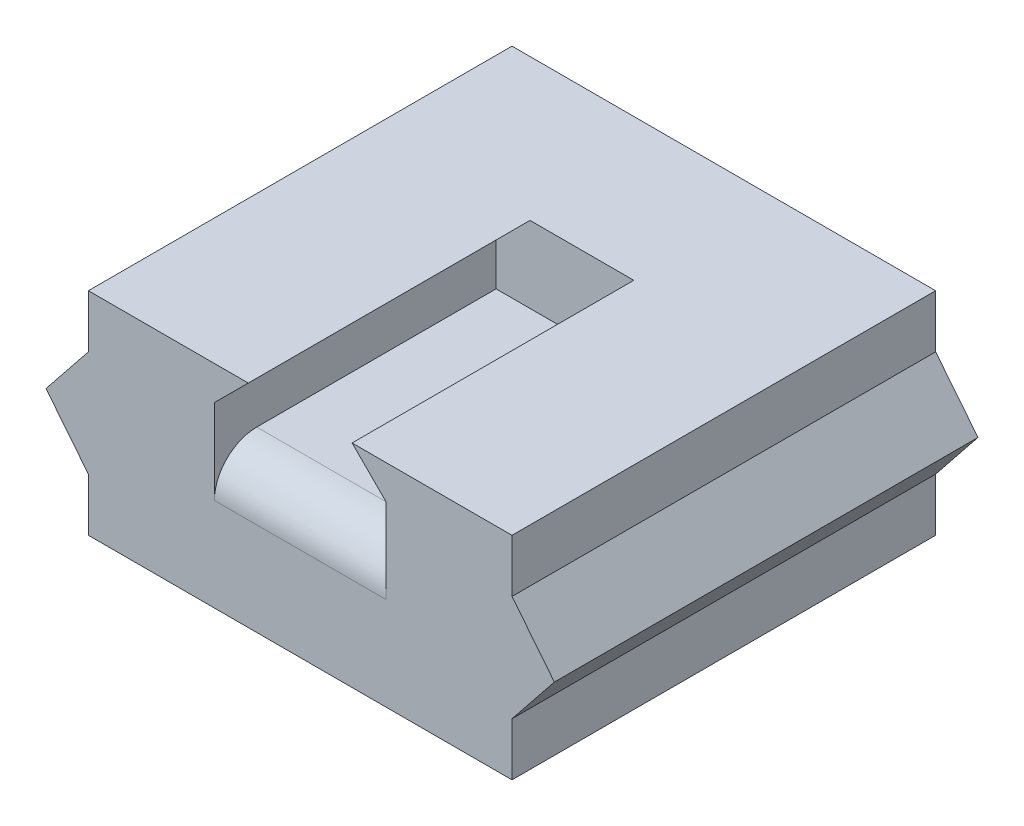
ISO-10303-21;
HEADER;
FILE_DESCRIPTION(('STEP AP214'),'2;1');
FILE_NAME('part.step','',(''),(''),'','','');
FILE_SCHEMA(('AUTOMOTIVE_DESIGN { 1 0 10303 214 1 1 1 1 }'));
ENDSEC;
DATA;
#1=APPLICATION_CONTEXT('core data for automotive mechanical design processes');
#2=APPLICATION_PROTOCOL_DEFINITION('international standard','automotive_design',2000,#1);
#3=PRODUCT_CONTEXT('',#1,'mechanical');
#4=PRODUCT('Part','Part','',(#3));
#5=PRODUCT_RELATED_PRODUCT_CATEGORY('part','',(#4));
#6=PRODUCT_DEFINITION_FORMATION('','',#4);
#7=PRODUCT_DEFINITION_CONTEXT('part definition',#1,'design');
#8=PRODUCT_DEFINITION('design','',#6,#7);
#9=PRODUCT_DEFINITION_SHAPE('','',#8);
#10=(LENGTH_UNIT() NAMED_UNIT(*) SI_UNIT(.MILLI.,.METRE.));
#11=(NAMED_UNIT(*) PLANE_ANGLE_UNIT() SI_UNIT($,.RADIAN.));
#12=(NAMED_UNIT(*) SI_UNIT($,.STERADIAN.) SOLID_ANGLE_UNIT());
#13=UNCERTAINTY_MEASURE_WITH_UNIT(LENGTH_MEASURE(1.E-05),#10,'distance_accuracy_value','');
#14=(GEOMETRIC_REPRESENTATION_CONTEXT(3) GLOBAL_UNCERTAINTY_ASSIGNED_CONTEXT((#13)) GLOBAL_UNIT_ASSIGNED_CONTEXT((#10,
#11,#12)) REPRESENTATION_CONTEXT('',''));
#15=CARTESIAN_POINT('',(0.,0.,0.));
#16=DIRECTION('',(0.,0.,1.));
#17=DIRECTION('',(1.,0.,0.));
#18=AXIS2_PLACEMENT_3D('',#15,#16,#17);
#19=CARTESIAN_POINT('',(-2.025,3.2,-1.65));
#20=DIRECTION('',(0.,0.,-1.));
#21=DIRECTION('',(-1.,0.,0.));
#22=AXIS2_PLACEMENT_3D('',#19,#20,#21);
#23=PLANE('',#22);
#24=DIRECTION('',(0.707106781186544,0.707106781186551,0.));
#25=VECTOR('',#24,1.);
#26=CARTESIAN_POINT('',(-2.025,4.19999999999999,-1.65));
#27=LINE('',#26,#25);
#28=CARTESIAN_POINT('',(-2.025,4.19999999999999,-1.65));
#29=VERTEX_POINT('',#28);
#30=CARTESIAN_POINT('',(-1.225,5.,-1.65));
#31=VERTEX_POINT('',#30);
#32=EDGE_CURVE('E156',#29,#31,#27,.T.);
#33=ORIENTED_EDGE('',*,*,#32,.F.);
#34=DIRECTION('',(0.,1.,0.));
#35=VECTOR('',#34,1.);
#36=CARTESIAN_POINT('',(-2.025,3.2,-1.65));
#37=LINE('',#36,#35);
#38=CARTESIAN_POINT('',(-2.025,3.2,-1.65));
#39=VERTEX_POINT('',#38);
#40=EDGE_CURVE('E167',#39,#29,#37,.T.);
#41=ORIENTED_EDGE('',*,*,#40,.F.);
#42=DIRECTION('',(-1.,0.,0.));
#43=VECTOR('',#42,1.);
#44=CARTESIAN_POINT('',(-2.025,3.2,-1.65));
#45=LINE('',#44,#43);
#46=CARTESIAN_POINT('',(2.025,3.2,-1.65));
#47=VERTEX_POINT('',#46);
#48=EDGE_CURVE('E266',#47,#39,#45,.T.);
#49=ORIENTED_EDGE('',*,*,#48,.F.);
#50=DIRECTION('',(0.,1.,0.));
#51=VECTOR('',#50,1.);
#52=CARTESIAN_POINT('',(2.025,3.2,-1.65));
#53=LINE('',#52,#51);
#54=CARTESIAN_POINT('',(2.025,4.19999999999999,-1.65));
#55=VERTEX_POINT('',#54);
#56=EDGE_CURVE('E177',#47,#55,#53,.T.);
#57=ORIENTED_EDGE('',*,*,#56,.T.);
#58=DIRECTION('',(0.707106781186544,-0.707106781186551,0.));
#59=VECTOR('',#58,1.);
#60=CARTESIAN_POINT('',(2.025,4.19999999999999,-1.65));
#61=LINE('',#60,#59);
#62=CARTESIAN_POINT('',(1.225,5.,-1.65));
#63=VERTEX_POINT('',#62);
#64=EDGE_CURVE('E280',#63,#55,#61,.T.);
#65=ORIENTED_EDGE('',*,*,#64,.F.);
#66=DIRECTION('',(-1.,0.,0.));
#67=VECTOR('',#66,1.);
#68=CARTESIAN_POINT('',(-2.025,5.,-1.65));
#69=LINE('',#68,#67);
#70=EDGE_CURVE('E170',#63,#31,#69,.T.);
#71=ORIENTED_EDGE('',*,*,#70,.T.);
#72=EDGE_LOOP('',(#33,#41,#49,#57,#65,#71));
#73=FACE_BOUND('',#72,.T.);
#74=ADVANCED_FACE('F34',(#73),#23,.F.);
#75=CARTESIAN_POINT('',(-2.025,3.2,1.65));
#76=DIRECTION('',(-1.,0.,0.));
#77=DIRECTION('',(0.,0.,1.));
#78=AXIS2_PLACEMENT_3D('',#75,#76,#77);
#79=PLANE('',#78);
#80=DIRECTION('',(0.,0.,-1.));
#81=VECTOR('',#80,1.);
#82=CARTESIAN_POINT('',(-2.025,4.19999999999999,6.13137084989848));
#83=LINE('',#82,#81);
#84=CARTESIAN_POINT('',(-2.025,4.19999999999999,5.));
#85=VERTEX_POINT('',#84);
#86=EDGE_CURVE('E152',#85,#29,#83,.T.);
#87=ORIENTED_EDGE('',*,*,#86,.F.);
#88=DIRECTION('',(0.,1.,0.));
#89=VECTOR('',#88,1.);
#90=CARTESIAN_POINT('',(-2.025,3.2,5.));
#91=LINE('',#90,#89);
#92=CARTESIAN_POINT('',(-2.025,2.2,5.));
#93=VERTEX_POINT('',#92);
#94=EDGE_CURVE('E259',#93,#85,#91,.T.);
#95=ORIENTED_EDGE('',*,*,#94,.F.);
#96=CARTESIAN_POINT('',(-2.025,2.2,4.));
#97=DIRECTION('',(-1.,0.,0.));
#98=DIRECTION('',(0.,0.,1.));
#99=AXIS2_PLACEMENT_3D('',#96,#97,#98);
#100=CIRCLE('',#99,1.);
#101=CARTESIAN_POINT('',(-2.025,3.2,4.));
#102=VERTEX_POINT('',#101);
#103=EDGE_CURVE('E42',#93,#102,#100,.T.);
#104=ORIENTED_EDGE('',*,*,#103,.T.);
#105=DIRECTION('',(0.,0.,1.));
#106=VECTOR('',#105,1.);
#107=CARTESIAN_POINT('',(-2.025,3.2,1.65));
#108=LINE('',#107,#106);
#109=EDGE_CURVE('E174',#39,#102,#108,.T.);
#110=ORIENTED_EDGE('',*,*,#109,.F.);
#111=ORIENTED_EDGE('',*,*,#40,.T.);
#112=EDGE_LOOP('',(#87,#95,#104,#110,#111));
#113=FACE_BOUND('',#112,.T.);
#114=ADVANCED_FACE('F172',(#113),#79,.F.);
#115=CARTESIAN_POINT('',(2.025,3.2,1.65));
#116=DIRECTION('',(1.,0.,0.));
#117=DIRECTION('',(0.,0.,-1.));
#118=AXIS2_PLACEMENT_3D('',#115,#116,#117);
#119=PLANE('',#118);
#120=DIRECTION('',(0.,0.,-1.));
#121=VECTOR('',#120,1.);
#122=CARTESIAN_POINT('',(2.025,4.19999999999999,6.13137084989848));
#123=LINE('',#122,#121);
#124=CARTESIAN_POINT('',(2.025,4.19999999999999,5.));
#125=VERTEX_POINT('',#124);
#126=EDGE_CURVE('E53',#125,#55,#123,.T.);
#127=ORIENTED_EDGE('',*,*,#126,.T.);
#128=ORIENTED_EDGE('',*,*,#56,.F.);
#129=DIRECTION('',(0.,0.,-1.));
#130=VECTOR('',#129,1.);
#131=CARTESIAN_POINT('',(2.025,3.2,1.65));
#132=LINE('',#131,#130);
#133=CARTESIAN_POINT('',(2.025,3.2,4.));
#134=VERTEX_POINT('',#133);
#135=EDGE_CURVE('E269',#134,#47,#132,.T.);
#136=ORIENTED_EDGE('',*,*,#135,.F.);
#137=CARTESIAN_POINT('',(2.025,2.2,4.));
#138=DIRECTION('',(1.,0.,0.));
#139=DIRECTION('',(0.,0.,-1.));
#140=AXIS2_PLACEMENT_3D('',#137,#138,#139);
#141=CIRCLE('',#140,1.);
#142=CARTESIAN_POINT('',(2.025,2.2,5.));
#143=VERTEX_POINT('',#142);
#144=EDGE_CURVE('E11',#134,#143,#141,.T.);
#145=ORIENTED_EDGE('',*,*,#144,.T.);
#146=DIRECTION('',(0.,-1.,0.));
#147=VECTOR('',#146,1.);
#148=CARTESIAN_POINT('',(2.025,5.,5.));
#149=LINE('',#148,#147);
#150=EDGE_CURVE('E48',#125,#143,#149,.T.);
#151=ORIENTED_EDGE('',*,*,#150,.F.);
#152=EDGE_LOOP('',(#127,#128,#136,#145,#151));
#153=FACE_BOUND('',#152,.T.);
#154=ADVANCED_FACE('F268',(#153),#119,.F.);
#155=CARTESIAN_POINT('',(5.,5.,5.));
#156=DIRECTION('',(-1.,0.,0.));
#157=DIRECTION('',(0.,0.,1.));
#158=AXIS2_PLACEMENT_3D('',#155,#156,#157);
#159=PLANE('',#158);
#160=DIRECTION('',(0.,0.,-1.));
#161=VECTOR('',#160,1.);
#162=CARTESIAN_POINT('',(5.,1.25,7.69258240356725));
#163=LINE('',#162,#161);
#164=CARTESIAN_POINT('',(5.,1.25,5.));
#165=VERTEX_POINT('',#164);
#166=CARTESIAN_POINT('',(5.,1.25,-5.));
#167=VERTEX_POINT('',#166);
#168=EDGE_CURVE('E195',#165,#167,#163,.T.);
#169=ORIENTED_EDGE('',*,*,#168,.F.);
#170=DIRECTION('',(0.,-1.,0.));
#171=VECTOR('',#170,1.);
#172=CARTESIAN_POINT('',(5.,5.,5.));
#173=LINE('',#172,#171);
#174=CARTESIAN_POINT('',(5.,0.,5.));
#175=VERTEX_POINT('',#174);
#176=EDGE_CURVE('E230',#165,#175,#173,.T.);
#177=ORIENTED_EDGE('',*,*,#176,.T.);
#178=DIRECTION('',(0.,0.,-1.));
#179=VECTOR('',#178,1.);
#180=CARTESIAN_POINT('',(5.,0.,5.));
#181=LINE('',#180,#179);
#182=CARTESIAN_POINT('',(5.,0.,-5.));
#183=VERTEX_POINT('',#182);
#184=EDGE_CURVE('E218',#175,#183,#181,.T.);
#185=ORIENTED_EDGE('',*,*,#184,.T.);
#186=DIRECTION('',(0.,-1.,0.));
#187=VECTOR('',#186,1.);
#188=CARTESIAN_POINT('',(5.,5.,-5.));
#189=LINE('',#188,#187);
#190=EDGE_CURVE('E250',#167,#183,#189,.T.);
#191=ORIENTED_EDGE('',*,*,#190,.F.);
#192=EDGE_LOOP('',(#169,#177,#185,#191));
#193=FACE_BOUND('',#192,.T.);
#194=ADVANCED_FACE('F322',(#193),#159,.F.);
#195=CARTESIAN_POINT('',(-5.,5.,5.));
#196=DIRECTION('',(1.,0.,0.));
#197=DIRECTION('',(0.,0.,-1.));
#198=AXIS2_PLACEMENT_3D('',#195,#196,#197);
#199=PLANE('',#198);
#200=DIRECTION('',(0.,0.,-1.));
#201=VECTOR('',#200,1.);
#202=CARTESIAN_POINT('',(-5.,3.75,7.69258240356725));
#203=LINE('',#202,#201);
#204=CARTESIAN_POINT('',(-5.,3.75,5.));
#205=VERTEX_POINT('',#204);
#206=CARTESIAN_POINT('',(-5.,3.75,-5.));
#207=VERTEX_POINT('',#206);
#208=EDGE_CURVE('E213',#205,#207,#203,.T.);
#209=ORIENTED_EDGE('',*,*,#208,.F.);
#210=DIRECTION('',(0.,-1.,0.));
#211=VECTOR('',#210,1.);
#212=CARTESIAN_POINT('',(-5.,5.,5.));
#213=LINE('',#212,#211);
#214=CARTESIAN_POINT('',(-5.,5.,5.));
#215=VERTEX_POINT('',#214);
#216=EDGE_CURVE('E244',#215,#205,#213,.T.);
#217=ORIENTED_EDGE('',*,*,#216,.F.);
#218=DIRECTION('',(0.,0.,1.));
#219=VECTOR('',#218,1.);
#220=CARTESIAN_POINT('',(-5.,5.,5.));
#221=LINE('',#220,#219);
#222=CARTESIAN_POINT('',(-5.,5.,-5.));
#223=VERTEX_POINT('',#222);
#224=EDGE_CURVE('E225',#223,#215,#221,.T.);
#225=ORIENTED_EDGE('',*,*,#224,.F.);
#226=DIRECTION('',(0.,-1.,0.));
#227=VECTOR('',#226,1.);
#228=CARTESIAN_POINT('',(-5.,5.,-5.));
#229=LINE('',#228,#227);
#230=EDGE_CURVE('E248',#223,#207,#229,.T.);
#231=ORIENTED_EDGE('',*,*,#230,.T.);
#232=EDGE_LOOP('',(#209,#217,#225,#231));
#233=FACE_BOUND('',#232,.T.);
#234=ADVANCED_FACE('F337',(#233),#199,.F.);
#235=CARTESIAN_POINT('',(5.,5.,5.));
#236=VERTEX_POINT('',#235);
#237=CARTESIAN_POINT('',(5.,3.75,5.));
#238=VERTEX_POINT('',#237);
#239=EDGE_CURVE('E241',#236,#238,#173,.T.);
#240=ORIENTED_EDGE('',*,*,#239,.T.);
#241=DIRECTION('',(0.,0.,-1.));
#242=VECTOR('',#241,1.);
#243=CARTESIAN_POINT('',(5.,3.75,7.69258240356725));
#244=LINE('',#243,#242);
#245=CARTESIAN_POINT('',(5.,3.75,-5.));
#246=VERTEX_POINT('',#245);
#247=EDGE_CURVE('E197',#238,#246,#244,.T.);
#248=ORIENTED_EDGE('',*,*,#247,.T.);
#249=CARTESIAN_POINT('',(5.,5.,-5.));
#250=VERTEX_POINT('',#249);
#251=EDGE_CURVE('E251',#250,#246,#189,.T.);
#252=ORIENTED_EDGE('',*,*,#251,.F.);
#253=DIRECTION('',(0.,0.,-1.));
#254=VECTOR('',#253,1.);
#255=CARTESIAN_POINT('',(5.,5.,5.));
#256=LINE('',#255,#254);
#257=EDGE_CURVE('E219',#236,#250,#256,.T.);
#258=ORIENTED_EDGE('',*,*,#257,.F.);
#259=EDGE_LOOP('',(#240,#248,#252,#258));
#260=FACE_BOUND('',#259,.T.);
#261=ADVANCED_FACE('F302',(#260),#159,.F.);
#262=CARTESIAN_POINT('',(-5.,5.,-5.));
#263=DIRECTION('',(0.,0.,1.));
#264=DIRECTION('',(1.,0.,0.));
#265=AXIS2_PLACEMENT_3D('',#262,#263,#264);
#266=PLANE('',#265);
#267=DIRECTION('',(-1.,0.,0.));
#268=VECTOR('',#267,1.);
#269=CARTESIAN_POINT('',(-5.,0.,-5.));
#270=LINE('',#269,#268);
#271=CARTESIAN_POINT('',(-5.,0.,-5.));
#272=VERTEX_POINT('',#271);
#273=EDGE_CURVE('E233',#183,#272,#270,.T.);
#274=ORIENTED_EDGE('',*,*,#273,.T.);
#275=CARTESIAN_POINT('',(-5.,1.25,-5.));
#276=VERTEX_POINT('',#275);
#277=EDGE_CURVE('E247',#276,#272,#229,.T.);
#278=ORIENTED_EDGE('',*,*,#277,.F.);
#279=DIRECTION('',(-0.624695047554424,0.78086880944303,0.));
#280=VECTOR('',#279,1.);
#281=CARTESIAN_POINT('',(-5.,1.25,-5.));
#282=LINE('',#281,#280);
#283=CARTESIAN_POINT('',(-6.,2.5,-5.));
#284=VERTEX_POINT('',#283);
#285=EDGE_CURVE('E191',#276,#284,#282,.T.);
#286=ORIENTED_EDGE('',*,*,#285,.T.);
#287=DIRECTION('',(0.624695047554424,0.78086880944303,0.));
#288=VECTOR('',#287,1.);
#289=CARTESIAN_POINT('',(-5.,3.75,-5.));
#290=LINE('',#289,#288);
#291=EDGE_CURVE('E208',#284,#207,#290,.T.);
#292=ORIENTED_EDGE('',*,*,#291,.T.);
#293=ORIENTED_EDGE('',*,*,#230,.F.);
#294=DIRECTION('',(-1.,0.,0.));
#295=VECTOR('',#294,1.);
#296=CARTESIAN_POINT('',(-5.,5.,-5.));
#297=LINE('',#296,#295);
#298=EDGE_CURVE('E222',#250,#223,#297,.T.);
#299=ORIENTED_EDGE('',*,*,#298,.F.);
#300=ORIENTED_EDGE('',*,*,#251,.T.);
#301=DIRECTION('',(0.624695047554424,-0.78086880944303,0.));
#302=VECTOR('',#301,1.);
#303=CARTESIAN_POINT('',(5.,3.75,-5.));
#304=LINE('',#303,#302);
#305=CARTESIAN_POINT('',(6.,2.5,-5.));
#306=VERTEX_POINT('',#305);
#307=EDGE_CURVE('E180',#246,#306,#304,.T.);
#308=ORIENTED_EDGE('',*,*,#307,.T.);
#309=DIRECTION('',(-0.624695047554425,-0.78086880944303,0.));
#310=VECTOR('',#309,1.);
#311=CARTESIAN_POINT('',(5.,1.25,-5.));
#312=LINE('',#311,#310);
#313=EDGE_CURVE('E176',#306,#167,#312,.T.);
#314=ORIENTED_EDGE('',*,*,#313,.T.);
#315=ORIENTED_EDGE('',*,*,#190,.T.);
#316=EDGE_LOOP('',(#274,#278,#286,#292,#293,#299,#300,#308,#314,#315));
#317=FACE_BOUND('',#316,.T.);
#318=ADVANCED_FACE('F305',(#317),#266,.F.);
#319=CARTESIAN_POINT('',(-5.,1.25,5.));
#320=VERTEX_POINT('',#319);
#321=CARTESIAN_POINT('',(-5.,0.,5.));
#322=VERTEX_POINT('',#321);
#323=EDGE_CURVE('E243',#320,#322,#213,.T.);
#324=ORIENTED_EDGE('',*,*,#323,.F.);
#325=DIRECTION('',(0.,0.,-1.));
#326=VECTOR('',#325,1.);
#327=CARTESIAN_POINT('',(-5.,1.25,7.69258240356725));
#328=LINE('',#327,#326);
#329=EDGE_CURVE('E205',#320,#276,#328,.T.);
#330=ORIENTED_EDGE('',*,*,#329,.T.);
#331=ORIENTED_EDGE('',*,*,#277,.T.);
#332=DIRECTION('',(0.,0.,1.));
#333=VECTOR('',#332,1.);
#334=CARTESIAN_POINT('',(-5.,0.,5.));
#335=LINE('',#334,#333);
#336=EDGE_CURVE('E236',#272,#322,#335,.T.);
#337=ORIENTED_EDGE('',*,*,#336,.T.);
#338=EDGE_LOOP('',(#324,#330,#331,#337));
#339=FACE_BOUND('',#338,.T.);
#340=ADVANCED_FACE('F327',(#339),#199,.F.);
#341=CARTESIAN_POINT('',(-5.,5.,5.));
#342=DIRECTION('',(0.,0.,-1.));
#343=DIRECTION('',(-1.,0.,0.));
#344=AXIS2_PLACEMENT_3D('',#341,#342,#343);
#345=PLANE('',#344);
#346=DIRECTION('',(-1.,0.,0.));
#347=VECTOR('',#346,1.);
#348=CARTESIAN_POINT('',(-5.,2.2,5.));
#349=LINE('',#348,#347);
#350=EDGE_CURVE('E254',#143,#93,#349,.T.);
#351=ORIENTED_EDGE('',*,*,#350,.T.);
#352=ORIENTED_EDGE('',*,*,#94,.T.);
#353=DIRECTION('',(-0.707106781186544,-0.707106781186551,0.));
#354=VECTOR('',#353,1.);
#355=CARTESIAN_POINT('',(-2.025,4.19999999999999,5.));
#356=LINE('',#355,#354);
#357=CARTESIAN_POINT('',(-1.225,5.,5.));
#358=VERTEX_POINT('',#357);
#359=EDGE_CURVE('E159',#358,#85,#356,.T.);
#360=ORIENTED_EDGE('',*,*,#359,.F.);
#361=DIRECTION('',(1.,0.,0.));
#362=VECTOR('',#361,1.);
#363=CARTESIAN_POINT('',(-5.,5.,5.));
#364=LINE('',#363,#362);
#365=EDGE_CURVE('E228',#215,#358,#364,.T.);
#366=ORIENTED_EDGE('',*,*,#365,.F.);
#367=ORIENTED_EDGE('',*,*,#216,.T.);
#368=DIRECTION('',(-0.624695047554424,-0.78086880944303,0.));
#369=VECTOR('',#368,1.);
#370=CARTESIAN_POINT('',(-5.,3.75,5.));
#371=LINE('',#370,#369);
#372=CARTESIAN_POINT('',(-6.,2.5,5.));
#373=VERTEX_POINT('',#372);
#374=EDGE_CURVE('E204',#205,#373,#371,.T.);
#375=ORIENTED_EDGE('',*,*,#374,.T.);
#376=DIRECTION('',(0.624695047554424,-0.78086880944303,0.));
#377=VECTOR('',#376,1.);
#378=CARTESIAN_POINT('',(-5.,1.25,5.));
#379=LINE('',#378,#377);
#380=EDGE_CURVE('E201',#373,#320,#379,.T.);
#381=ORIENTED_EDGE('',*,*,#380,.T.);
#382=ORIENTED_EDGE('',*,*,#323,.T.);
#383=DIRECTION('',(1.,0.,0.));
#384=VECTOR('',#383,1.);
#385=CARTESIAN_POINT('',(-5.,0.,5.));
#386=LINE('',#385,#384);
#387=EDGE_CURVE('E223',#322,#175,#386,.T.);
#388=ORIENTED_EDGE('',*,*,#387,.T.);
#389=ORIENTED_EDGE('',*,*,#176,.F.);
#390=DIRECTION('',(0.624695047554425,0.78086880944303,0.));
#391=VECTOR('',#390,1.);
#392=CARTESIAN_POINT('',(5.,1.25,5.));
#393=LINE('',#392,#391);
#394=CARTESIAN_POINT('',(6.,2.5,5.));
#395=VERTEX_POINT('',#394);
#396=EDGE_CURVE('E189',#165,#395,#393,.T.);
#397=ORIENTED_EDGE('',*,*,#396,.T.);
#398=DIRECTION('',(-0.624695047554424,0.78086880944303,0.));
#399=VECTOR('',#398,1.);
#400=CARTESIAN_POINT('',(5.,3.75,5.));
#401=LINE('',#400,#399);
#402=EDGE_CURVE('E186',#395,#238,#401,.T.);
#403=ORIENTED_EDGE('',*,*,#402,.T.);
#404=ORIENTED_EDGE('',*,*,#239,.F.);
#405=CARTESIAN_POINT('',(1.225,5.,5.));
#406=VERTEX_POINT('',#405);
#407=EDGE_CURVE('E227',#406,#236,#364,.T.);
#408=ORIENTED_EDGE('',*,*,#407,.F.);
#409=DIRECTION('',(-0.707106781186544,0.707106781186551,0.));
#410=VECTOR('',#409,1.);
#411=CARTESIAN_POINT('',(2.025,4.19999999999999,5.));
#412=LINE('',#411,#410);
#413=EDGE_CURVE('E275',#125,#406,#412,.T.);
#414=ORIENTED_EDGE('',*,*,#413,.F.);
#415=ORIENTED_EDGE('',*,*,#150,.T.);
#416=EDGE_LOOP('',(#351,#352,#360,#366,#367,#375,#381,#382,#388,#389,#397,#403,#404,#408,#414,#415));
#417=FACE_BOUND('',#416,.T.);
#418=ADVANCED_FACE('F293',(#417),#345,.F.);
#419=CARTESIAN_POINT('',(0.,5.,0.));
#420=DIRECTION('',(0.,-1.,0.));
#421=DIRECTION('',(0.,0.,-1.));
#422=AXIS2_PLACEMENT_3D('',#419,#420,#421);
#423=PLANE('',#422);
#424=ORIENTED_EDGE('',*,*,#365,.T.);
#425=DIRECTION('',(0.,0.,-1.));
#426=VECTOR('',#425,1.);
#427=CARTESIAN_POINT('',(-1.225,5.,6.13137084989848));
#428=LINE('',#427,#426);
#429=EDGE_CURVE('E163',#358,#31,#428,.T.);
#430=ORIENTED_EDGE('',*,*,#429,.T.);
#431=ORIENTED_EDGE('',*,*,#70,.F.);
#432=DIRECTION('',(0.,0.,-1.));
#433=VECTOR('',#432,1.);
#434=CARTESIAN_POINT('',(1.225,5.,6.13137084989848));
#435=LINE('',#434,#433);
#436=EDGE_CURVE('E276',#406,#63,#435,.T.);
#437=ORIENTED_EDGE('',*,*,#436,.F.);
#438=ORIENTED_EDGE('',*,*,#407,.T.);
#439=ORIENTED_EDGE('',*,*,#257,.T.);
#440=ORIENTED_EDGE('',*,*,#298,.T.);
#441=ORIENTED_EDGE('',*,*,#224,.T.);
#442=EDGE_LOOP('',(#424,#430,#431,#437,#438,#439,#440,#441));
#443=FACE_BOUND('',#442,.T.);
#444=ADVANCED_FACE('F287',(#443),#423,.F.);
#445=CARTESIAN_POINT('',(0.,0.,0.));
#446=DIRECTION('',(0.,-1.,0.));
#447=DIRECTION('',(0.,0.,-1.));
#448=AXIS2_PLACEMENT_3D('',#445,#446,#447);
#449=PLANE('',#448);
#450=ORIENTED_EDGE('',*,*,#184,.F.);
#451=ORIENTED_EDGE('',*,*,#387,.F.);
#452=ORIENTED_EDGE('',*,*,#336,.F.);
#453=ORIENTED_EDGE('',*,*,#273,.F.);
#454=EDGE_LOOP('',(#450,#451,#452,#453));
#455=FACE_BOUND('',#454,.T.);
#456=ADVANCED_FACE('F320',(#455),#449,.T.);
#457=CARTESIAN_POINT('',(-5.,1.25,7.69258240356725));
#458=DIRECTION('',(-0.78086880944303,-0.624695047554424,0.));
#459=DIRECTION('',(0.624695047554424,-0.78086880944303,0.));
#460=AXIS2_PLACEMENT_3D('',#457,#458,#459);
#461=PLANE('',#460);
#462=ORIENTED_EDGE('',*,*,#380,.F.);
#463=DIRECTION('',(0.,0.,-1.));
#464=VECTOR('',#463,1.);
#465=CARTESIAN_POINT('',(-6.,2.5,7.69258240356725));
#466=LINE('',#465,#464);
#467=EDGE_CURVE('E211',#373,#284,#466,.T.);
#468=ORIENTED_EDGE('',*,*,#467,.T.);
#469=ORIENTED_EDGE('',*,*,#285,.F.);
#470=ORIENTED_EDGE('',*,*,#329,.F.);
#471=EDGE_LOOP('',(#462,#468,#469,#470));
#472=FACE_BOUND('',#471,.T.);
#473=ADVANCED_FACE('F330',(#472),#461,.T.);
#474=CARTESIAN_POINT('',(-5.,3.75,7.69258240356725));
#475=DIRECTION('',(-0.78086880944303,0.624695047554424,0.));
#476=DIRECTION('',(-0.624695047554424,-0.78086880944303,0.));
#477=AXIS2_PLACEMENT_3D('',#474,#475,#476);
#478=PLANE('',#477);
#479=ORIENTED_EDGE('',*,*,#374,.F.);
#480=ORIENTED_EDGE('',*,*,#208,.T.);
#481=ORIENTED_EDGE('',*,*,#291,.F.);
#482=ORIENTED_EDGE('',*,*,#467,.F.);
#483=EDGE_LOOP('',(#479,#480,#481,#482));
#484=FACE_BOUND('',#483,.T.);
#485=ADVANCED_FACE('F335',(#484),#478,.T.);
#486=CARTESIAN_POINT('',(5.,1.25,7.69258240356725));
#487=DIRECTION('',(0.78086880944303,-0.624695047554425,0.));
#488=DIRECTION('',(0.624695047554425,0.78086880944303,0.));
#489=AXIS2_PLACEMENT_3D('',#486,#487,#488);
#490=PLANE('',#489);
#491=ORIENTED_EDGE('',*,*,#396,.F.);
#492=ORIENTED_EDGE('',*,*,#168,.T.);
#493=ORIENTED_EDGE('',*,*,#313,.F.);
#494=DIRECTION('',(0.,0.,-1.));
#495=VECTOR('',#494,1.);
#496=CARTESIAN_POINT('',(6.,2.5,7.69258240356725));
#497=LINE('',#496,#495);
#498=EDGE_CURVE('E190',#395,#306,#497,.T.);
#499=ORIENTED_EDGE('',*,*,#498,.F.);
#500=EDGE_LOOP('',(#491,#492,#493,#499));
#501=FACE_BOUND('',#500,.T.);
#502=ADVANCED_FACE('F313',(#501),#490,.T.);
#503=CARTESIAN_POINT('',(5.,3.75,7.69258240356725));
#504=DIRECTION('',(0.78086880944303,0.624695047554424,0.));
#505=DIRECTION('',(-0.624695047554424,0.78086880944303,0.));
#506=AXIS2_PLACEMENT_3D('',#503,#504,#505);
#507=PLANE('',#506);
#508=ORIENTED_EDGE('',*,*,#402,.F.);
#509=ORIENTED_EDGE('',*,*,#498,.T.);
#510=ORIENTED_EDGE('',*,*,#307,.F.);
#511=ORIENTED_EDGE('',*,*,#247,.F.);
#512=EDGE_LOOP('',(#508,#509,#510,#511));
#513=FACE_BOUND('',#512,.T.);
#514=ADVANCED_FACE('F308',(#513),#507,.T.);
#515=CARTESIAN_POINT('',(0.,3.2,0.));
#516=DIRECTION('',(0.,-1.,0.));
#517=DIRECTION('',(0.,0.,-1.));
#518=AXIS2_PLACEMENT_3D('',#515,#516,#517);
#519=PLANE('',#518);
#520=ORIENTED_EDGE('',*,*,#109,.T.);
#521=DIRECTION('',(-1.,0.,0.));
#522=VECTOR('',#521,1.);
#523=CARTESIAN_POINT('',(0.,3.2,4.));
#524=LINE('',#523,#522);
#525=EDGE_CURVE('E257',#102,#134,#524,.F.);
#526=ORIENTED_EDGE('',*,*,#525,.T.);
#527=ORIENTED_EDGE('',*,*,#135,.T.);
#528=ORIENTED_EDGE('',*,*,#48,.T.);
#529=EDGE_LOOP('',(#520,#526,#527,#528));
#530=FACE_BOUND('',#529,.T.);
#531=ADVANCED_FACE('F264',(#530),#519,.F.);
#532=CARTESIAN_POINT('',(-5.,2.2,4.));
#533=DIRECTION('',(-1.,0.,0.));
#534=DIRECTION('',(0.,0.,1.));
#535=AXIS2_PLACEMENT_3D('',#532,#533,#534);
#536=CYLINDRICAL_SURFACE('',#535,1.);
#537=ORIENTED_EDGE('',*,*,#144,.F.);
#538=ORIENTED_EDGE('',*,*,#525,.F.);
#539=ORIENTED_EDGE('',*,*,#103,.F.);
#540=ORIENTED_EDGE('',*,*,#350,.F.);
#541=EDGE_LOOP('',(#537,#538,#539,#540));
#542=FACE_BOUND('',#541,.T.);
#543=ADVANCED_FACE('F36',(#542),#536,.T.);
#544=CARTESIAN_POINT('',(2.025,4.19999999999999,6.13137084989848));
#545=DIRECTION('',(0.707106781186551,0.707106781186544,0.));
#546=DIRECTION('',(-0.707106781186544,0.707106781186551,0.));
#547=AXIS2_PLACEMENT_3D('',#544,#545,#546);
#548=PLANE('',#547);
#549=ORIENTED_EDGE('',*,*,#126,.F.);
#550=ORIENTED_EDGE('',*,*,#413,.T.);
#551=ORIENTED_EDGE('',*,*,#436,.T.);
#552=ORIENTED_EDGE('',*,*,#64,.T.);
#553=EDGE_LOOP('',(#549,#550,#551,#552));
#554=FACE_BOUND('',#553,.T.);
#555=ADVANCED_FACE('F296',(#554),#548,.F.);
#556=CARTESIAN_POINT('',(-2.025,4.19999999999999,6.13137084989848));
#557=DIRECTION('',(-0.707106781186551,0.707106781186544,0.));
#558=DIRECTION('',(-0.707106781186544,-0.707106781186551,0.));
#559=AXIS2_PLACEMENT_3D('',#556,#557,#558);
#560=PLANE('',#559);
#561=ORIENTED_EDGE('',*,*,#429,.F.);
#562=ORIENTED_EDGE('',*,*,#359,.T.);
#563=ORIENTED_EDGE('',*,*,#86,.T.);
#564=ORIENTED_EDGE('',*,*,#32,.T.);
#565=EDGE_LOOP('',(#561,#562,#563,#564));
#566=FACE_BOUND('',#565,.T.);
#567=ADVANCED_FACE('F155',(#566),#560,.F.);
#568=CLOSED_SHELL('',(#74,#114,#154,#194,#234,#261,#318,#340,#418,#444,#456,#473,#485,#502,#514,
#531,#543,#555,#567));
#569=MANIFOLD_SOLID_BREP('B2',#568);
#570=ADVANCED_BREP_SHAPE_REPRESENTATION('',(#18,#569),#14);
#571=SHAPE_DEFINITION_REPRESENTATION(#9,#570);
ENDSEC;
END-ISO-10303-21;
